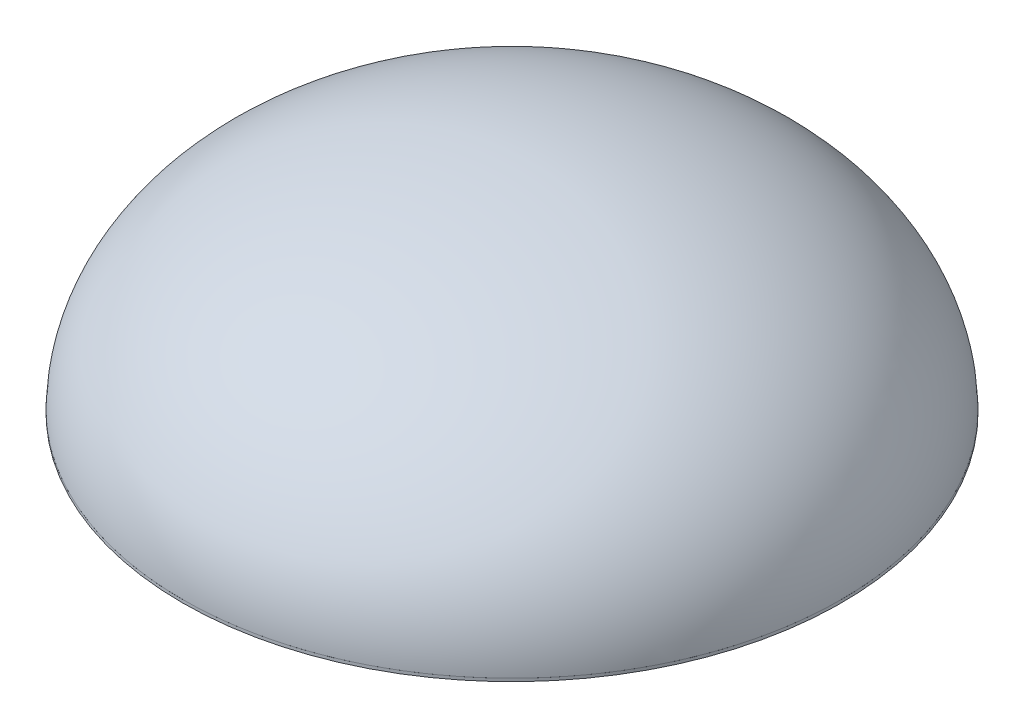
ISO-10303-21;
HEADER;
FILE_DESCRIPTION(('STEP AP214'),'2;1');
FILE_NAME('part.step','',(''),(''),'','','');
FILE_SCHEMA(('AUTOMOTIVE_DESIGN { 1 0 10303 214 1 1 1 1 }'));
ENDSEC;
DATA;
#1=APPLICATION_CONTEXT('core data for automotive mechanical design processes');
#2=APPLICATION_PROTOCOL_DEFINITION('international standard','automotive_design',2000,#1);
#3=PRODUCT_CONTEXT('',#1,'mechanical');
#4=PRODUCT('Part','Part','',(#3));
#5=PRODUCT_RELATED_PRODUCT_CATEGORY('part','',(#4));
#6=PRODUCT_DEFINITION_FORMATION('','',#4);
#7=PRODUCT_DEFINITION_CONTEXT('part definition',#1,'design');
#8=PRODUCT_DEFINITION('design','',#6,#7);
#9=PRODUCT_DEFINITION_SHAPE('','',#8);
#10=(LENGTH_UNIT() NAMED_UNIT(*) SI_UNIT(.MILLI.,.METRE.));
#11=(NAMED_UNIT(*) PLANE_ANGLE_UNIT() SI_UNIT($,.RADIAN.));
#12=(NAMED_UNIT(*) SI_UNIT($,.STERADIAN.) SOLID_ANGLE_UNIT());
#13=UNCERTAINTY_MEASURE_WITH_UNIT(LENGTH_MEASURE(1.E-05),#10,'distance_accuracy_value','');
#14=(GEOMETRIC_REPRESENTATION_CONTEXT(3) GLOBAL_UNCERTAINTY_ASSIGNED_CONTEXT((#13)) GLOBAL_UNIT_ASSIGNED_CONTEXT((#10,
#11,#12)) REPRESENTATION_CONTEXT('',''));
#15=CARTESIAN_POINT('',(0.,0.,0.));
#16=DIRECTION('',(0.,0.,1.));
#17=DIRECTION('',(1.,0.,0.));
#18=AXIS2_PLACEMENT_3D('',#15,#16,#17);
#19=CARTESIAN_POINT('',(0.,1.,0.));
#20=DIRECTION('',(0.,1.,0.));
#21=DIRECTION('',(0.,0.,1.));
#22=AXIS2_PLACEMENT_3D('',#19,#20,#21);
#23=PLANE('',#22);
#24=CARTESIAN_POINT('',(0.,0.999999999999973,0.));
#25=DIRECTION('',(0.,-1.,0.));
#26=DIRECTION('',(0.,0.,-1.));
#27=AXIS2_PLACEMENT_3D('',#24,#25,#26);
#28=CIRCLE('',#27,109.539314926306);
#29=CARTESIAN_POINT('',(0.,1.,-109.539314926306));
#30=VERTEX_POINT('',#29);
#31=EDGE_CURVE('E12',#30,#30,#28,.F.);
#32=ORIENTED_EDGE('',*,*,#31,.F.);
#33=EDGE_LOOP('',(#32));
#34=FACE_BOUND('',#33,.T.);
#35=CARTESIAN_POINT('',(0.,1.,0.));
#36=DIRECTION('',(0.,1.,0.));
#37=DIRECTION('',(0.,0.,1.));
#38=AXIS2_PLACEMENT_3D('',#35,#36,#37);
#39=CIRCLE('',#38,109.55);
#40=CARTESIAN_POINT('',(0.,1.,109.55));
#41=VERTEX_POINT('',#40);
#42=EDGE_CURVE('E52',#41,#41,#39,.T.);
#43=ORIENTED_EDGE('',*,*,#42,.T.);
#44=EDGE_LOOP('',(#43));
#45=FACE_BOUND('',#44,.T.);
#46=ADVANCED_FACE('F43',(#34,#45),#23,.T.);
#47=CARTESIAN_POINT('',(0.,0.,0.));
#48=DIRECTION('',(0.,1.,0.));
#49=DIRECTION('',(0.,0.,1.));
#50=AXIS2_PLACEMENT_3D('',#47,#48,#49);
#51=PLANE('',#50);
#52=CARTESIAN_POINT('',(0.,0.,0.));
#53=DIRECTION('',(0.,1.,0.));
#54=DIRECTION('',(0.,0.,1.));
#55=AXIS2_PLACEMENT_3D('',#52,#53,#54);
#56=CIRCLE('',#55,109.55);
#57=CARTESIAN_POINT('',(0.,0.,109.55));
#58=VERTEX_POINT('',#57);
#59=EDGE_CURVE('E47',#58,#58,#56,.T.);
#60=ORIENTED_EDGE('',*,*,#59,.F.);
#61=EDGE_LOOP('',(#60));
#62=FACE_BOUND('',#61,.T.);
#63=CARTESIAN_POINT('',(0.,0.,0.));
#64=DIRECTION('',(0.,-1.,0.));
#65=DIRECTION('',(0.,0.,-1.));
#66=AXIS2_PLACEMENT_3D('',#63,#64,#65);
#67=CIRCLE('',#66,101.35);
#68=CARTESIAN_POINT('',(0.,0.,-101.35));
#69=VERTEX_POINT('',#68);
#70=EDGE_CURVE('E88',#69,#69,#67,.T.);
#71=ORIENTED_EDGE('',*,*,#70,.F.);
#72=EDGE_LOOP('',(#71));
#73=FACE_BOUND('',#72,.T.);
#74=ADVANCED_FACE('F70',(#62,#73),#51,.F.);
#75=CARTESIAN_POINT('',(0.,1.,0.));
#76=DIRECTION('',(0.,-1.,0.));
#77=DIRECTION('',(0.,0.,-1.));
#78=AXIS2_PLACEMENT_3D('',#75,#76,#77);
#79=CYLINDRICAL_SURFACE('',#78,109.55);
#80=ORIENTED_EDGE('',*,*,#42,.F.);
#81=EDGE_LOOP('',(#80));
#82=FACE_BOUND('',#81,.T.);
#83=ORIENTED_EDGE('',*,*,#59,.T.);
#84=EDGE_LOOP('',(#83));
#85=FACE_BOUND('',#84,.T.);
#86=ADVANCED_FACE('F45',(#82,#85),#79,.T.);
#87=CARTESIAN_POINT('',(0.,0.,-101.35));
#88=CARTESIAN_POINT('',(0.,1.93750009137695,-101.35));
#89=CARTESIAN_POINT('',(0.,5.79558993492346,-101.060020098063));
#90=CARTESIAN_POINT('',(0.,13.5160712044724,-99.3121940003754));
#91=CARTESIAN_POINT('',(0.,23.0922202177469,-94.8944701774659));
#92=CARTESIAN_POINT('',(0.,34.0939139160511,-85.9352839141648));
#93=CARTESIAN_POINT('',(0.,44.0334156817508,-73.4859855005316));
#94=CARTESIAN_POINT('',(0.,52.3616252078919,-57.9849898064585));
#95=CARTESIAN_POINT('',(0.,58.6314195173169,-40.0599807405299));
#96=CARTESIAN_POINT('',(0.,61.8726391099966,-23.7234577717956));
#97=CARTESIAN_POINT('',(0.,63.1809335494046,-10.2307625559142));
#98=CARTESIAN_POINT('',(0.,63.3999999999999,-3.40542554681152));
#99=CARTESIAN_POINT('',(0.,63.3999999999999,0.));
#100=B_SPLINE_CURVE_WITH_KNOTS('',3,(#87,#88,#89,#90,#91,#92,#93,#94,#95,#96,#97,#98,#99),
.UNSPECIFIED.,.F.,.F.,(4,1,1,1,1,1,1,1,1,1,4),(0.,0.098174770424681,0.196349540849362,
0.392699081698724,0.589048622548086,0.785398163397448,0.981747704246811,1.17809724509617,
1.37444678594553,1.47262155637022,1.5707963267949),.UNSPECIFIED.);
#101=CARTESIAN_POINT('',(0.,0.,0.));
#102=DIRECTION('',(0.,-1.,0.));
#103=AXIS1_PLACEMENT('',#101,#102);
#104=SURFACE_OF_REVOLUTION('',#100,#103);
#105=CARTESIAN_POINT('',(0.,63.3999999999999,0.));
#106=VERTEX_POINT('',#105);
#107=VERTEX_LOOP('',#106);
#108=FACE_BOUND('',#107,.T.);
#109=ORIENTED_EDGE('',*,*,#70,.T.);
#110=EDGE_LOOP('',(#109));
#111=FACE_BOUND('',#110,.T.);
#112=ADVANCED_FACE('F61',(#108,#111),#104,.T.);
#113=CARTESIAN_POINT('',(0.,0.,0.));
#114=DIRECTION('',(1.,0.,0.));
#115=DIRECTION('',(0.,0.,-1.));
#116=AXIS2_PLACEMENT_3D('',#113,#114,#115);
#117=ELLIPSE('',#116,109.55,71.5999999999999);
#118=TRIMMED_CURVE('',#117,(PARAMETER_VALUE(-1.5707963267949)),
(PARAMETER_VALUE(1.5707963267949)),.T.,.PARAMETER.);
#119=CARTESIAN_POINT('',(0.,0.,0.));
#120=DIRECTION('',(0.,-1.,0.));
#121=AXIS1_PLACEMENT('',#119,#120);
#122=SURFACE_OF_REVOLUTION('',#118,#121);
#123=ORIENTED_EDGE('',*,*,#31,.T.);
#124=EDGE_LOOP('',(#123));
#125=FACE_BOUND('',#124,.T.);
#126=CARTESIAN_POINT('',(0.,71.5999999999999,0.));
#127=VERTEX_POINT('',#126);
#128=VERTEX_LOOP('',#127);
#129=FACE_BOUND('',#128,.T.);
#130=ADVANCED_FACE('F59',(#125,#129),#122,.F.);
#131=CLOSED_SHELL('',(#46,#74,#86,#112,#130));
#132=MANIFOLD_SOLID_BREP('B2',#131);
#133=ADVANCED_BREP_SHAPE_REPRESENTATION('',(#18,#132),#14);
#134=SHAPE_DEFINITION_REPRESENTATION(#9,#133);
ENDSEC;
END-ISO-10303-21;
